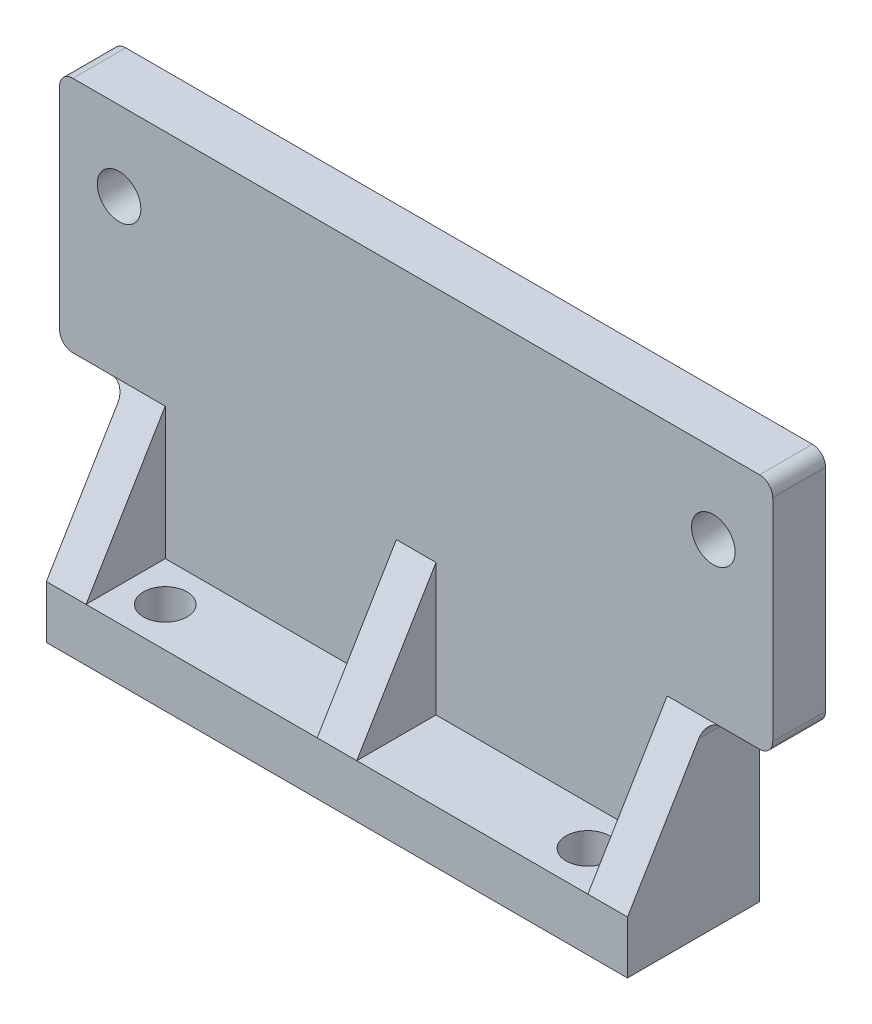
ISO-10303-21;
HEADER;
FILE_DESCRIPTION(('STEP AP214'),'2;1');
FILE_NAME('part.step','',(''),(''),'','','');
FILE_SCHEMA(('AUTOMOTIVE_DESIGN { 1 0 10303 214 1 1 1 1 }'));
ENDSEC;
DATA;
#1=APPLICATION_CONTEXT('core data for automotive mechanical design processes');
#2=APPLICATION_PROTOCOL_DEFINITION('international standard','automotive_design',2000,#1);
#3=PRODUCT_CONTEXT('',#1,'mechanical');
#4=PRODUCT('Part','Part','',(#3));
#5=PRODUCT_RELATED_PRODUCT_CATEGORY('part','',(#4));
#6=PRODUCT_DEFINITION_FORMATION('','',#4);
#7=PRODUCT_DEFINITION_CONTEXT('part definition',#1,'design');
#8=PRODUCT_DEFINITION('design','',#6,#7);
#9=PRODUCT_DEFINITION_SHAPE('','',#8);
#10=(LENGTH_UNIT() NAMED_UNIT(*) SI_UNIT(.MILLI.,.METRE.));
#11=(NAMED_UNIT(*) PLANE_ANGLE_UNIT() SI_UNIT($,.RADIAN.));
#12=(NAMED_UNIT(*) SI_UNIT($,.STERADIAN.) SOLID_ANGLE_UNIT());
#13=UNCERTAINTY_MEASURE_WITH_UNIT(LENGTH_MEASURE(1.E-05),#10,'distance_accuracy_value','');
#14=(GEOMETRIC_REPRESENTATION_CONTEXT(3) GLOBAL_UNCERTAINTY_ASSIGNED_CONTEXT((#13)) GLOBAL_UNIT_ASSIGNED_CONTEXT((#10,
#11,#12)) REPRESENTATION_CONTEXT('',''));
#15=CARTESIAN_POINT('',(0.,0.,0.));
#16=DIRECTION('',(0.,0.,1.));
#17=DIRECTION('',(1.,0.,0.));
#18=AXIS2_PLACEMENT_3D('',#15,#16,#17);
#19=CARTESIAN_POINT('',(0.,4.,0.));
#20=DIRECTION('',(1.,0.,0.));
#21=DIRECTION('',(0.,0.,-1.));
#22=AXIS2_PLACEMENT_3D('',#19,#20,#21);
#23=PLANE('',#22);
#24=DIRECTION('',(0.,-0.857492925712544,0.514495755427526));
#25=VECTOR('',#24,1.);
#26=CARTESIAN_POINT('',(0.,14.,-6.));
#27=LINE('',#26,#25);
#28=CARTESIAN_POINT('',(0.,13.,-5.4));
#29=VERTEX_POINT('',#28);
#30=CARTESIAN_POINT('',(0.,4.,0.));
#31=VERTEX_POINT('',#30);
#32=EDGE_CURVE('E302',#29,#31,#27,.T.);
#33=ORIENTED_EDGE('',*,*,#32,.F.);
#34=DIRECTION('',(0.,0.,1.));
#35=VECTOR('',#34,1.);
#36=CARTESIAN_POINT('',(0.,13.,-10.));
#37=LINE('',#36,#35);
#38=CARTESIAN_POINT('',(0.,13.,-10.));
#39=VERTEX_POINT('',#38);
#40=EDGE_CURVE('E286',#29,#39,#37,.F.);
#41=ORIENTED_EDGE('',*,*,#40,.T.);
#42=DIRECTION('',(0.,-1.,0.));
#43=VECTOR('',#42,1.);
#44=CARTESIAN_POINT('',(0.,4.,-10.));
#45=LINE('',#44,#43);
#46=CARTESIAN_POINT('',(0.,0.,-10.));
#47=VERTEX_POINT('',#46);
#48=EDGE_CURVE('E327',#39,#47,#45,.T.);
#49=ORIENTED_EDGE('',*,*,#48,.T.);
#50=DIRECTION('',(0.,0.,1.));
#51=VECTOR('',#50,1.);
#52=CARTESIAN_POINT('',(0.,0.,0.));
#53=LINE('',#52,#51);
#54=CARTESIAN_POINT('',(0.,0.,0.));
#55=VERTEX_POINT('',#54);
#56=EDGE_CURVE('E407',#47,#55,#53,.T.);
#57=ORIENTED_EDGE('',*,*,#56,.T.);
#58=DIRECTION('',(0.,-1.,0.));
#59=VECTOR('',#58,1.);
#60=CARTESIAN_POINT('',(0.,4.,0.));
#61=LINE('',#60,#59);
#62=EDGE_CURVE('E313',#31,#55,#61,.T.);
#63=ORIENTED_EDGE('',*,*,#62,.F.);
#64=EDGE_LOOP('',(#33,#41,#49,#57,#63));
#65=FACE_BOUND('',#64,.T.);
#66=ADVANCED_FACE('F39',(#65),#23,.F.);
#67=CARTESIAN_POINT('',(44.,4.,0.));
#68=DIRECTION('',(-1.,0.,0.));
#69=DIRECTION('',(0.,0.,1.));
#70=AXIS2_PLACEMENT_3D('',#67,#68,#69);
#71=PLANE('',#70);
#72=DIRECTION('',(0.,-1.,0.));
#73=VECTOR('',#72,1.);
#74=CARTESIAN_POINT('',(44.,4.,-10.));
#75=LINE('',#74,#73);
#76=CARTESIAN_POINT('',(44.,13.,-10.));
#77=VERTEX_POINT('',#76);
#78=CARTESIAN_POINT('',(44.,0.,-10.));
#79=VERTEX_POINT('',#78);
#80=EDGE_CURVE('E429',#77,#79,#75,.T.);
#81=ORIENTED_EDGE('',*,*,#80,.F.);
#82=DIRECTION('',(0.,0.,-1.));
#83=VECTOR('',#82,1.);
#84=CARTESIAN_POINT('',(44.,13.,-6.));
#85=LINE('',#84,#83);
#86=CARTESIAN_POINT('',(44.,13.,-5.4));
#87=VERTEX_POINT('',#86);
#88=EDGE_CURVE('E230',#77,#87,#85,.F.);
#89=ORIENTED_EDGE('',*,*,#88,.T.);
#90=DIRECTION('',(0.,-0.857492925712544,0.514495755427526));
#91=VECTOR('',#90,1.);
#92=CARTESIAN_POINT('',(44.,14.,-6.));
#93=LINE('',#92,#91);
#94=CARTESIAN_POINT('',(44.,4.,0.));
#95=VERTEX_POINT('',#94);
#96=EDGE_CURVE('E373',#87,#95,#93,.T.);
#97=ORIENTED_EDGE('',*,*,#96,.T.);
#98=DIRECTION('',(0.,-1.,0.));
#99=VECTOR('',#98,1.);
#100=CARTESIAN_POINT('',(44.,4.,0.));
#101=LINE('',#100,#99);
#102=CARTESIAN_POINT('',(44.,0.,0.));
#103=VERTEX_POINT('',#102);
#104=EDGE_CURVE('E432',#95,#103,#101,.T.);
#105=ORIENTED_EDGE('',*,*,#104,.T.);
#106=DIRECTION('',(0.,0.,-1.));
#107=VECTOR('',#106,1.);
#108=CARTESIAN_POINT('',(44.,0.,0.));
#109=LINE('',#108,#107);
#110=EDGE_CURVE('E420',#103,#79,#109,.T.);
#111=ORIENTED_EDGE('',*,*,#110,.T.);
#112=EDGE_LOOP('',(#81,#89,#97,#105,#111));
#113=FACE_BOUND('',#112,.T.);
#114=ADVANCED_FACE('F529',(#113),#71,.F.);
#115=CARTESIAN_POINT('',(0.,4.,0.));
#116=DIRECTION('',(0.,-1.,0.));
#117=DIRECTION('',(0.,0.,-1.));
#118=AXIS2_PLACEMENT_3D('',#115,#116,#117);
#119=PLANE('',#118);
#120=CARTESIAN_POINT('',(6.,4.,-3.));
#121=DIRECTION('',(0.,1.,0.));
#122=DIRECTION('',(0.,0.,1.));
#123=AXIS2_PLACEMENT_3D('',#120,#121,#122);
#124=CIRCLE('',#123,1.65);
#125=CARTESIAN_POINT('',(6.,4.,-1.35));
#126=VERTEX_POINT('',#125);
#127=EDGE_CURVE('E395',#126,#126,#124,.T.);
#128=ORIENTED_EDGE('',*,*,#127,.F.);
#129=EDGE_LOOP('',(#128));
#130=FACE_BOUND('',#129,.T.);
#131=DIRECTION('',(1.,0.,0.));
#132=VECTOR('',#131,1.);
#133=CARTESIAN_POINT('',(0.,4.,-6.));
#134=LINE('',#133,#132);
#135=CARTESIAN_POINT('',(3.,4.,-6.));
#136=VERTEX_POINT('',#135);
#137=CARTESIAN_POINT('',(20.5,4.,-6.));
#138=VERTEX_POINT('',#137);
#139=EDGE_CURVE('E176',#136,#138,#134,.T.);
#140=ORIENTED_EDGE('',*,*,#139,.F.);
#141=DIRECTION('',(0.,0.,1.));
#142=VECTOR('',#141,1.);
#143=CARTESIAN_POINT('',(3.,4.,0.));
#144=LINE('',#143,#142);
#145=CARTESIAN_POINT('',(3.,4.,0.));
#146=VERTEX_POINT('',#145);
#147=EDGE_CURVE('E357',#136,#146,#144,.T.);
#148=ORIENTED_EDGE('',*,*,#147,.T.);
#149=DIRECTION('',(1.,0.,0.));
#150=VECTOR('',#149,1.);
#151=CARTESIAN_POINT('',(0.,4.,0.));
#152=LINE('',#151,#150);
#153=CARTESIAN_POINT('',(20.5,4.,0.));
#154=VERTEX_POINT('',#153);
#155=EDGE_CURVE('E194',#146,#154,#152,.T.);
#156=ORIENTED_EDGE('',*,*,#155,.T.);
#157=DIRECTION('',(0.,0.,1.));
#158=VECTOR('',#157,1.);
#159=CARTESIAN_POINT('',(20.5,4.,0.));
#160=LINE('',#159,#158);
#161=EDGE_CURVE('E191',#138,#154,#160,.T.);
#162=ORIENTED_EDGE('',*,*,#161,.F.);
#163=EDGE_LOOP('',(#140,#148,#156,#162));
#164=FACE_BOUND('',#163,.T.);
#165=ADVANCED_FACE('F192',(#130,#164),#119,.F.);
#166=CARTESIAN_POINT('',(38.,4.,-3.));
#167=DIRECTION('',(0.,1.,0.));
#168=DIRECTION('',(0.,0.,1.));
#169=AXIS2_PLACEMENT_3D('',#166,#167,#168);
#170=CIRCLE('',#169,1.65);
#171=CARTESIAN_POINT('',(38.,4.,-1.35000000000001));
#172=VERTEX_POINT('',#171);
#173=EDGE_CURVE('E403',#172,#172,#170,.T.);
#174=ORIENTED_EDGE('',*,*,#173,.F.);
#175=EDGE_LOOP('',(#174));
#176=FACE_BOUND('',#175,.T.);
#177=CARTESIAN_POINT('',(23.5,4.,-6.));
#178=VERTEX_POINT('',#177);
#179=CARTESIAN_POINT('',(41.,4.,-6.));
#180=VERTEX_POINT('',#179);
#181=EDGE_CURVE('E188',#178,#180,#134,.T.);
#182=ORIENTED_EDGE('',*,*,#181,.F.);
#183=DIRECTION('',(0.,0.,1.));
#184=VECTOR('',#183,1.);
#185=CARTESIAN_POINT('',(23.5,4.,0.));
#186=LINE('',#185,#184);
#187=CARTESIAN_POINT('',(23.5,4.,0.));
#188=VERTEX_POINT('',#187);
#189=EDGE_CURVE('E200',#178,#188,#186,.T.);
#190=ORIENTED_EDGE('',*,*,#189,.T.);
#191=CARTESIAN_POINT('',(41.,4.,0.));
#192=VERTEX_POINT('',#191);
#193=EDGE_CURVE('E414',#188,#192,#152,.T.);
#194=ORIENTED_EDGE('',*,*,#193,.T.);
#195=DIRECTION('',(0.,0.,1.));
#196=VECTOR('',#195,1.);
#197=CARTESIAN_POINT('',(41.,4.,0.));
#198=LINE('',#197,#196);
#199=EDGE_CURVE('E376',#180,#192,#198,.T.);
#200=ORIENTED_EDGE('',*,*,#199,.F.);
#201=EDGE_LOOP('',(#182,#190,#194,#200));
#202=FACE_BOUND('',#201,.T.);
#203=ADVANCED_FACE('F558',(#176,#202),#119,.F.);
#204=CARTESIAN_POINT('',(0.,0.,0.));
#205=DIRECTION('',(0.,-1.,0.));
#206=DIRECTION('',(0.,0.,-1.));
#207=AXIS2_PLACEMENT_3D('',#204,#205,#206);
#208=PLANE('',#207);
#209=ORIENTED_EDGE('',*,*,#110,.F.);
#210=DIRECTION('',(1.,0.,0.));
#211=VECTOR('',#210,1.);
#212=CARTESIAN_POINT('',(0.,0.,0.));
#213=LINE('',#212,#211);
#214=EDGE_CURVE('E417',#55,#103,#213,.T.);
#215=ORIENTED_EDGE('',*,*,#214,.F.);
#216=ORIENTED_EDGE('',*,*,#56,.F.);
#217=DIRECTION('',(-1.,0.,0.));
#218=VECTOR('',#217,1.);
#219=CARTESIAN_POINT('',(0.,0.,-10.));
#220=LINE('',#219,#218);
#221=EDGE_CURVE('E424',#79,#47,#220,.T.);
#222=ORIENTED_EDGE('',*,*,#221,.F.);
#223=EDGE_LOOP('',(#209,#215,#216,#222));
#224=FACE_BOUND('',#223,.T.);
#225=CARTESIAN_POINT('',(38.,0.,-3.));
#226=DIRECTION('',(0.,1.,0.));
#227=DIRECTION('',(0.,0.,1.));
#228=AXIS2_PLACEMENT_3D('',#225,#226,#227);
#229=CIRCLE('',#228,1.65);
#230=CARTESIAN_POINT('',(38.,0.,-1.35000000000001));
#231=VERTEX_POINT('',#230);
#232=EDGE_CURVE('E399',#231,#231,#229,.T.);
#233=ORIENTED_EDGE('',*,*,#232,.T.);
#234=EDGE_LOOP('',(#233));
#235=FACE_BOUND('',#234,.T.);
#236=CARTESIAN_POINT('',(6.,0.,-3.));
#237=DIRECTION('',(0.,1.,0.));
#238=DIRECTION('',(0.,0.,1.));
#239=AXIS2_PLACEMENT_3D('',#236,#237,#238);
#240=CIRCLE('',#239,1.65);
#241=CARTESIAN_POINT('',(6.,0.,-1.35));
#242=VERTEX_POINT('',#241);
#243=EDGE_CURVE('E393',#242,#242,#240,.T.);
#244=ORIENTED_EDGE('',*,*,#243,.T.);
#245=EDGE_LOOP('',(#244));
#246=FACE_BOUND('',#245,.T.);
#247=ADVANCED_FACE('F564',(#224,#235,#246),#208,.T.);
#248=CARTESIAN_POINT('',(0.,4.,0.));
#249=DIRECTION('',(0.,0.,-1.));
#250=DIRECTION('',(-1.,0.,0.));
#251=AXIS2_PLACEMENT_3D('',#248,#249,#250);
#252=PLANE('',#251);
#253=ORIENTED_EDGE('',*,*,#155,.F.);
#254=EDGE_CURVE('E411',#31,#146,#152,.T.);
#255=ORIENTED_EDGE('',*,*,#254,.F.);
#256=ORIENTED_EDGE('',*,*,#62,.T.);
#257=ORIENTED_EDGE('',*,*,#214,.T.);
#258=ORIENTED_EDGE('',*,*,#104,.F.);
#259=DIRECTION('',(1.,0.,0.));
#260=VECTOR('',#259,1.);
#261=CARTESIAN_POINT('',(0.,4.,0.));
#262=LINE('',#261,#260);
#263=EDGE_CURVE('E383',#192,#95,#262,.T.);
#264=ORIENTED_EDGE('',*,*,#263,.F.);
#265=ORIENTED_EDGE('',*,*,#193,.F.);
#266=DIRECTION('',(1.,0.,0.));
#267=VECTOR('',#266,1.);
#268=CARTESIAN_POINT('',(0.,4.,0.));
#269=LINE('',#268,#267);
#270=EDGE_CURVE('E368',#154,#188,#269,.T.);
#271=ORIENTED_EDGE('',*,*,#270,.F.);
#272=EDGE_LOOP('',(#253,#255,#256,#257,#258,#264,#265,#271));
#273=FACE_BOUND('',#272,.T.);
#274=ADVANCED_FACE('F538',(#273),#252,.F.);
#275=CARTESIAN_POINT('',(0.,4.,-10.));
#276=DIRECTION('',(0.,0.,1.));
#277=DIRECTION('',(1.,0.,0.));
#278=AXIS2_PLACEMENT_3D('',#275,#276,#277);
#279=PLANE('',#278);
#280=CARTESIAN_POINT('',(-0.499999999999994,26.,-10.));
#281=DIRECTION('',(0.,0.,1.));
#282=DIRECTION('',(1.,0.,0.));
#283=AXIS2_PLACEMENT_3D('',#280,#281,#282);
#284=CIRCLE('',#283,1.65);
#285=CARTESIAN_POINT('',(1.15,26.,-10.));
#286=VERTEX_POINT('',#285);
#287=EDGE_CURVE('E487',#286,#286,#284,.T.);
#288=ORIENTED_EDGE('',*,*,#287,.T.);
#289=EDGE_LOOP('',(#288));
#290=FACE_BOUND('',#289,.T.);
#291=CARTESIAN_POINT('',(44.5,26.,-10.));
#292=DIRECTION('',(0.,0.,1.));
#293=DIRECTION('',(1.,0.,0.));
#294=AXIS2_PLACEMENT_3D('',#291,#292,#293);
#295=CIRCLE('',#294,1.65);
#296=CARTESIAN_POINT('',(46.15,26.,-10.));
#297=VERTEX_POINT('',#296);
#298=EDGE_CURVE('E499',#297,#297,#295,.T.);
#299=ORIENTED_EDGE('',*,*,#298,.T.);
#300=EDGE_LOOP('',(#299));
#301=FACE_BOUND('',#300,.T.);
#302=DIRECTION('',(0.,1.,0.));
#303=VECTOR('',#302,1.);
#304=CARTESIAN_POINT('',(49.,14.,-10.));
#305=LINE('',#304,#303);
#306=CARTESIAN_POINT('',(49.,15.,-10.));
#307=VERTEX_POINT('',#306);
#308=CARTESIAN_POINT('',(49.,31.,-10.));
#309=VERTEX_POINT('',#308);
#310=EDGE_CURVE('E340',#307,#309,#305,.T.);
#311=ORIENTED_EDGE('',*,*,#310,.F.);
#312=CARTESIAN_POINT('',(48.,15.,-10.));
#313=DIRECTION('',(0.,0.,1.));
#314=DIRECTION('',(1.,0.,0.));
#315=AXIS2_PLACEMENT_3D('',#312,#313,#314);
#316=CIRCLE('',#315,1.);
#317=CARTESIAN_POINT('',(48.,14.,-10.));
#318=VERTEX_POINT('',#317);
#319=EDGE_CURVE('E250',#307,#318,#316,.F.);
#320=ORIENTED_EDGE('',*,*,#319,.T.);
#321=DIRECTION('',(-1.,0.,0.));
#322=VECTOR('',#321,1.);
#323=CARTESIAN_POINT('',(49.,14.,-10.));
#324=LINE('',#323,#322);
#325=CARTESIAN_POINT('',(45.,14.,-10.));
#326=VERTEX_POINT('',#325);
#327=EDGE_CURVE('E349',#318,#326,#324,.T.);
#328=ORIENTED_EDGE('',*,*,#327,.T.);
#329=CARTESIAN_POINT('',(45.,13.,-10.));
#330=DIRECTION('',(0.,0.,1.));
#331=DIRECTION('',(1.,0.,0.));
#332=AXIS2_PLACEMENT_3D('',#329,#330,#331);
#333=CIRCLE('',#332,1.);
#334=EDGE_CURVE('E289',#326,#77,#333,.T.);
#335=ORIENTED_EDGE('',*,*,#334,.T.);
#336=ORIENTED_EDGE('',*,*,#80,.T.);
#337=ORIENTED_EDGE('',*,*,#221,.T.);
#338=ORIENTED_EDGE('',*,*,#48,.F.);
#339=CARTESIAN_POINT('',(-1.,13.,-10.));
#340=DIRECTION('',(0.,0.,1.));
#341=DIRECTION('',(1.,0.,0.));
#342=AXIS2_PLACEMENT_3D('',#339,#340,#341);
#343=CIRCLE('',#342,1.);
#344=CARTESIAN_POINT('',(-1.,14.,-10.));
#345=VERTEX_POINT('',#344);
#346=EDGE_CURVE('E11',#39,#345,#343,.T.);
#347=ORIENTED_EDGE('',*,*,#346,.T.);
#348=DIRECTION('',(1.,0.,0.));
#349=VECTOR('',#348,1.);
#350=CARTESIAN_POINT('',(-5.,14.,-10.));
#351=LINE('',#350,#349);
#352=CARTESIAN_POINT('',(-4.,14.,-10.));
#353=VERTEX_POINT('',#352);
#354=EDGE_CURVE('E324',#353,#345,#351,.T.);
#355=ORIENTED_EDGE('',*,*,#354,.F.);
#356=CARTESIAN_POINT('',(-4.,15.,-10.));
#357=DIRECTION('',(0.,0.,1.));
#358=DIRECTION('',(1.,0.,0.));
#359=AXIS2_PLACEMENT_3D('',#356,#357,#358);
#360=CIRCLE('',#359,1.);
#361=CARTESIAN_POINT('',(-5.,15.,-10.));
#362=VERTEX_POINT('',#361);
#363=EDGE_CURVE('E241',#353,#362,#360,.F.);
#364=ORIENTED_EDGE('',*,*,#363,.T.);
#365=DIRECTION('',(0.,-1.,0.));
#366=VECTOR('',#365,1.);
#367=CARTESIAN_POINT('',(-5.,14.,-10.));
#368=LINE('',#367,#366);
#369=CARTESIAN_POINT('',(-5.,31.,-10.));
#370=VERTEX_POINT('',#369);
#371=EDGE_CURVE('E342',#370,#362,#368,.T.);
#372=ORIENTED_EDGE('',*,*,#371,.F.);
#373=CARTESIAN_POINT('',(-4.,31.,-10.));
#374=DIRECTION('',(0.,0.,1.));
#375=DIRECTION('',(1.,0.,0.));
#376=AXIS2_PLACEMENT_3D('',#373,#374,#375);
#377=CIRCLE('',#376,1.);
#378=CARTESIAN_POINT('',(-4.,32.,-10.));
#379=VERTEX_POINT('',#378);
#380=EDGE_CURVE('E244',#370,#379,#377,.F.);
#381=ORIENTED_EDGE('',*,*,#380,.T.);
#382=DIRECTION('',(-1.,0.,0.));
#383=VECTOR('',#382,1.);
#384=CARTESIAN_POINT('',(0.,32.,-10.));
#385=LINE('',#384,#383);
#386=CARTESIAN_POINT('',(48.,32.,-10.));
#387=VERTEX_POINT('',#386);
#388=EDGE_CURVE('E390',#387,#379,#385,.T.);
#389=ORIENTED_EDGE('',*,*,#388,.F.);
#390=CARTESIAN_POINT('',(48.,31.,-10.));
#391=DIRECTION('',(0.,0.,1.));
#392=DIRECTION('',(1.,0.,0.));
#393=AXIS2_PLACEMENT_3D('',#390,#391,#392);
#394=CIRCLE('',#393,1.);
#395=EDGE_CURVE('E247',#387,#309,#394,.F.);
#396=ORIENTED_EDGE('',*,*,#395,.T.);
#397=EDGE_LOOP('',(#311,#320,#328,#335,#336,#337,#338,#347,#355,#364,#372,#381,#389,#396));
#398=FACE_BOUND('',#397,.T.);
#399=ADVANCED_FACE('F323',(#290,#301,#398),#279,.F.);
#400=CARTESIAN_POINT('',(38.,4.,-3.));
#401=DIRECTION('',(0.,-1.,0.));
#402=DIRECTION('',(0.,0.,-1.));
#403=AXIS2_PLACEMENT_3D('',#400,#401,#402);
#404=CYLINDRICAL_SURFACE('',#403,1.65);
#405=ORIENTED_EDGE('',*,*,#173,.T.);
#406=EDGE_LOOP('',(#405));
#407=FACE_BOUND('',#406,.T.);
#408=ORIENTED_EDGE('',*,*,#232,.F.);
#409=EDGE_LOOP('',(#408));
#410=FACE_BOUND('',#409,.T.);
#411=ADVANCED_FACE('F574',(#407,#410),#404,.F.);
#412=CARTESIAN_POINT('',(6.,4.,-3.));
#413=DIRECTION('',(0.,-1.,0.));
#414=DIRECTION('',(0.,0.,-1.));
#415=AXIS2_PLACEMENT_3D('',#412,#413,#414);
#416=CYLINDRICAL_SURFACE('',#415,1.65);
#417=ORIENTED_EDGE('',*,*,#127,.T.);
#418=EDGE_LOOP('',(#417));
#419=FACE_BOUND('',#418,.T.);
#420=ORIENTED_EDGE('',*,*,#243,.F.);
#421=EDGE_LOOP('',(#420));
#422=FACE_BOUND('',#421,.T.);
#423=ADVANCED_FACE('F511',(#419,#422),#416,.F.);
#424=CARTESIAN_POINT('',(0.,32.,-6.));
#425=DIRECTION('',(0.,0.,-1.));
#426=DIRECTION('',(-1.,0.,0.));
#427=AXIS2_PLACEMENT_3D('',#424,#425,#426);
#428=PLANE('',#427);
#429=CARTESIAN_POINT('',(-0.499999999999994,26.,-6.));
#430=DIRECTION('',(0.,0.,1.));
#431=DIRECTION('',(1.,0.,0.));
#432=AXIS2_PLACEMENT_3D('',#429,#430,#431);
#433=CIRCLE('',#432,1.65);
#434=CARTESIAN_POINT('',(1.15,26.,-6.));
#435=VERTEX_POINT('',#434);
#436=EDGE_CURVE('E492',#435,#435,#433,.T.);
#437=ORIENTED_EDGE('',*,*,#436,.F.);
#438=EDGE_LOOP('',(#437));
#439=FACE_BOUND('',#438,.T.);
#440=CARTESIAN_POINT('',(44.5,26.,-6.));
#441=DIRECTION('',(0.,0.,1.));
#442=DIRECTION('',(1.,0.,0.));
#443=AXIS2_PLACEMENT_3D('',#440,#441,#442);
#444=CIRCLE('',#443,1.65);
#445=CARTESIAN_POINT('',(46.15,26.,-6.));
#446=VERTEX_POINT('',#445);
#447=EDGE_CURVE('E495',#446,#446,#444,.T.);
#448=ORIENTED_EDGE('',*,*,#447,.F.);
#449=EDGE_LOOP('',(#448));
#450=FACE_BOUND('',#449,.T.);
#451=DIRECTION('',(-1.,0.,0.));
#452=VECTOR('',#451,1.);
#453=CARTESIAN_POINT('',(49.,14.,-6.));
#454=LINE('',#453,#452);
#455=CARTESIAN_POINT('',(48.,14.,-6.));
#456=VERTEX_POINT('',#455);
#457=CARTESIAN_POINT('',(45.,14.,-6.));
#458=VERTEX_POINT('',#457);
#459=EDGE_CURVE('E316',#456,#458,#454,.T.);
#460=ORIENTED_EDGE('',*,*,#459,.F.);
#461=CARTESIAN_POINT('',(48.,15.,-6.));
#462=DIRECTION('',(0.,0.,-1.));
#463=DIRECTION('',(-1.,0.,0.));
#464=AXIS2_PLACEMENT_3D('',#461,#462,#463);
#465=CIRCLE('',#464,1.);
#466=CARTESIAN_POINT('',(49.,15.,-6.));
#467=VERTEX_POINT('',#466);
#468=EDGE_CURVE('E262',#456,#467,#465,.F.);
#469=ORIENTED_EDGE('',*,*,#468,.T.);
#470=DIRECTION('',(0.,-1.,0.));
#471=VECTOR('',#470,1.);
#472=CARTESIAN_POINT('',(49.,14.,-6.));
#473=LINE('',#472,#471);
#474=CARTESIAN_POINT('',(49.,31.,-6.));
#475=VERTEX_POINT('',#474);
#476=EDGE_CURVE('E334',#475,#467,#473,.T.);
#477=ORIENTED_EDGE('',*,*,#476,.F.);
#478=CARTESIAN_POINT('',(48.,31.,-6.));
#479=DIRECTION('',(0.,0.,-1.));
#480=DIRECTION('',(-1.,0.,0.));
#481=AXIS2_PLACEMENT_3D('',#478,#479,#480);
#482=CIRCLE('',#481,1.);
#483=CARTESIAN_POINT('',(48.,32.,-6.));
#484=VERTEX_POINT('',#483);
#485=EDGE_CURVE('E259',#475,#484,#482,.F.);
#486=ORIENTED_EDGE('',*,*,#485,.T.);
#487=DIRECTION('',(1.,0.,0.));
#488=VECTOR('',#487,1.);
#489=CARTESIAN_POINT('',(0.,32.,-6.));
#490=LINE('',#489,#488);
#491=CARTESIAN_POINT('',(-4.,32.,-6.));
#492=VERTEX_POINT('',#491);
#493=EDGE_CURVE('E187',#492,#484,#490,.T.);
#494=ORIENTED_EDGE('',*,*,#493,.F.);
#495=CARTESIAN_POINT('',(-4.,31.,-6.));
#496=DIRECTION('',(0.,0.,-1.));
#497=DIRECTION('',(-1.,0.,0.));
#498=AXIS2_PLACEMENT_3D('',#495,#496,#497);
#499=CIRCLE('',#498,1.);
#500=CARTESIAN_POINT('',(-5.,31.,-6.));
#501=VERTEX_POINT('',#500);
#502=EDGE_CURVE('E256',#492,#501,#499,.F.);
#503=ORIENTED_EDGE('',*,*,#502,.T.);
#504=DIRECTION('',(0.,1.,0.));
#505=VECTOR('',#504,1.);
#506=CARTESIAN_POINT('',(-5.,14.,-6.));
#507=LINE('',#506,#505);
#508=CARTESIAN_POINT('',(-5.,15.,-6.));
#509=VERTEX_POINT('',#508);
#510=EDGE_CURVE('E481',#509,#501,#507,.T.);
#511=ORIENTED_EDGE('',*,*,#510,.F.);
#512=CARTESIAN_POINT('',(-4.,15.,-6.));
#513=DIRECTION('',(0.,0.,-1.));
#514=DIRECTION('',(-1.,0.,0.));
#515=AXIS2_PLACEMENT_3D('',#512,#513,#514);
#516=CIRCLE('',#515,1.);
#517=CARTESIAN_POINT('',(-4.,14.,-6.));
#518=VERTEX_POINT('',#517);
#519=EDGE_CURVE('E253',#509,#518,#516,.F.);
#520=ORIENTED_EDGE('',*,*,#519,.T.);
#521=DIRECTION('',(1.,0.,0.));
#522=VECTOR('',#521,1.);
#523=CARTESIAN_POINT('',(-5.,14.,-6.));
#524=LINE('',#523,#522);
#525=CARTESIAN_POINT('',(-1.,14.,-6.));
#526=VERTEX_POINT('',#525);
#527=EDGE_CURVE('E335',#518,#526,#524,.T.);
#528=ORIENTED_EDGE('',*,*,#527,.T.);
#529=DIRECTION('',(1.,0.,0.));
#530=VECTOR('',#529,1.);
#531=CARTESIAN_POINT('',(0.,14.,-6.));
#532=LINE('',#531,#530);
#533=CARTESIAN_POINT('',(3.,14.,-6.));
#534=VERTEX_POINT('',#533);
#535=EDGE_CURVE('E220',#526,#534,#532,.T.);
#536=ORIENTED_EDGE('',*,*,#535,.T.);
#537=DIRECTION('',(0.,-1.,0.));
#538=VECTOR('',#537,1.);
#539=CARTESIAN_POINT('',(3.,32.,-6.));
#540=LINE('',#539,#538);
#541=EDGE_CURVE('E183',#534,#136,#540,.T.);
#542=ORIENTED_EDGE('',*,*,#541,.T.);
#543=ORIENTED_EDGE('',*,*,#139,.T.);
#544=DIRECTION('',(0.,-1.,0.));
#545=VECTOR('',#544,1.);
#546=CARTESIAN_POINT('',(20.5,32.,-6.));
#547=LINE('',#546,#545);
#548=CARTESIAN_POINT('',(20.5,14.,-6.));
#549=VERTEX_POINT('',#548);
#550=EDGE_CURVE('E180',#549,#138,#547,.T.);
#551=ORIENTED_EDGE('',*,*,#550,.F.);
#552=DIRECTION('',(1.,0.,0.));
#553=VECTOR('',#552,1.);
#554=CARTESIAN_POINT('',(0.,14.,-6.));
#555=LINE('',#554,#553);
#556=CARTESIAN_POINT('',(23.5,14.,-6.));
#557=VERTEX_POINT('',#556);
#558=EDGE_CURVE('E206',#549,#557,#555,.T.);
#559=ORIENTED_EDGE('',*,*,#558,.T.);
#560=DIRECTION('',(0.,-1.,0.));
#561=VECTOR('',#560,1.);
#562=CARTESIAN_POINT('',(23.5,32.,-6.));
#563=LINE('',#562,#561);
#564=EDGE_CURVE('E210',#557,#178,#563,.T.);
#565=ORIENTED_EDGE('',*,*,#564,.T.);
#566=ORIENTED_EDGE('',*,*,#181,.T.);
#567=DIRECTION('',(0.,-1.,0.));
#568=VECTOR('',#567,1.);
#569=CARTESIAN_POINT('',(41.,32.,-6.));
#570=LINE('',#569,#568);
#571=CARTESIAN_POINT('',(41.,14.,-6.));
#572=VERTEX_POINT('',#571);
#573=EDGE_CURVE('E212',#572,#180,#570,.T.);
#574=ORIENTED_EDGE('',*,*,#573,.F.);
#575=DIRECTION('',(1.,0.,0.));
#576=VECTOR('',#575,1.);
#577=CARTESIAN_POINT('',(0.,14.,-6.));
#578=LINE('',#577,#576);
#579=EDGE_CURVE('E56',#572,#458,#578,.T.);
#580=ORIENTED_EDGE('',*,*,#579,.T.);
#581=EDGE_LOOP('',(#460,#469,#477,#486,#494,#503,#511,#520,#528,#536,#542,#543,#551,#559,#565,
#566,#574,#580));
#582=FACE_BOUND('',#581,.T.);
#583=ADVANCED_FACE('F178',(#439,#450,#582),#428,.F.);
#584=CARTESIAN_POINT('',(0.,32.,0.));
#585=DIRECTION('',(0.,1.,0.));
#586=DIRECTION('',(0.,0.,1.));
#587=AXIS2_PLACEMENT_3D('',#584,#585,#586);
#588=PLANE('',#587);
#589=ORIENTED_EDGE('',*,*,#493,.T.);
#590=DIRECTION('',(0.,0.,1.));
#591=VECTOR('',#590,1.);
#592=CARTESIAN_POINT('',(48.,32.,-10.));
#593=LINE('',#592,#591);
#594=EDGE_CURVE('E268',#484,#387,#593,.F.);
#595=ORIENTED_EDGE('',*,*,#594,.T.);
#596=ORIENTED_EDGE('',*,*,#388,.T.);
#597=DIRECTION('',(0.,0.,-1.));
#598=VECTOR('',#597,1.);
#599=CARTESIAN_POINT('',(-4.,32.,0.));
#600=LINE('',#599,#598);
#601=EDGE_CURVE('E265',#379,#492,#600,.F.);
#602=ORIENTED_EDGE('',*,*,#601,.T.);
#603=EDGE_LOOP('',(#589,#595,#596,#602));
#604=FACE_BOUND('',#603,.T.);
#605=ADVANCED_FACE('F470',(#604),#588,.T.);
#606=CARTESIAN_POINT('',(44.,14.,-6.));
#607=DIRECTION('',(0.,0.514495755427526,0.857492925712544));
#608=DIRECTION('',(0.,-0.857492925712544,0.514495755427526));
#609=AXIS2_PLACEMENT_3D('',#606,#607,#608);
#610=PLANE('',#609);
#611=DIRECTION('',(0.,-0.857492925712544,0.514495755427526));
#612=VECTOR('',#611,1.);
#613=CARTESIAN_POINT('',(41.,14.,-6.));
#614=LINE('',#613,#612);
#615=EDGE_CURVE('E372',#572,#192,#614,.T.);
#616=ORIENTED_EDGE('',*,*,#615,.T.);
#617=ORIENTED_EDGE('',*,*,#263,.T.);
#618=ORIENTED_EDGE('',*,*,#96,.F.);
#619=CARTESIAN_POINT('',(45.,13.,-5.4));
#620=DIRECTION('',(0.,0.514495755427526,0.857492925712544));
#621=DIRECTION('',(0.,-0.857492925712544,0.514495755427526));
#622=AXIS2_PLACEMENT_3D('',#619,#620,#621);
#623=ELLIPSE('',#622,1.16619037896906,1.);
#624=EDGE_CURVE('E292',#87,#458,#623,.F.);
#625=ORIENTED_EDGE('',*,*,#624,.T.);
#626=ORIENTED_EDGE('',*,*,#579,.F.);
#627=EDGE_LOOP('',(#616,#617,#618,#625,#626));
#628=FACE_BOUND('',#627,.T.);
#629=ADVANCED_FACE('F445',(#628),#610,.T.);
#630=CARTESIAN_POINT('',(41.,16.,-5.));
#631=DIRECTION('',(1.,0.,0.));
#632=DIRECTION('',(0.,0.,-1.));
#633=AXIS2_PLACEMENT_3D('',#630,#631,#632);
#634=PLANE('',#633);
#635=ORIENTED_EDGE('',*,*,#573,.T.);
#636=ORIENTED_EDGE('',*,*,#199,.T.);
#637=ORIENTED_EDGE('',*,*,#615,.F.);
#638=EDGE_LOOP('',(#635,#636,#637));
#639=FACE_BOUND('',#638,.T.);
#640=ADVANCED_FACE('F441',(#639),#634,.F.);
#641=CARTESIAN_POINT('',(23.5,14.,-6.));
#642=DIRECTION('',(0.,0.514495755427526,0.857492925712544));
#643=DIRECTION('',(0.,-0.857492925712544,0.514495755427526));
#644=AXIS2_PLACEMENT_3D('',#641,#642,#643);
#645=PLANE('',#644);
#646=DIRECTION('',(0.,-0.857492925712544,0.514495755427526));
#647=VECTOR('',#646,1.);
#648=CARTESIAN_POINT('',(20.5,14.,-6.));
#649=LINE('',#648,#647);
#650=EDGE_CURVE('E204',#549,#154,#649,.T.);
#651=ORIENTED_EDGE('',*,*,#650,.T.);
#652=ORIENTED_EDGE('',*,*,#270,.T.);
#653=DIRECTION('',(0.,-0.857492925712544,0.514495755427526));
#654=VECTOR('',#653,1.);
#655=CARTESIAN_POINT('',(23.5,14.,-6.));
#656=LINE('',#655,#654);
#657=EDGE_CURVE('E201',#557,#188,#656,.T.);
#658=ORIENTED_EDGE('',*,*,#657,.F.);
#659=ORIENTED_EDGE('',*,*,#558,.F.);
#660=EDGE_LOOP('',(#651,#652,#658,#659));
#661=FACE_BOUND('',#660,.T.);
#662=ADVANCED_FACE('F773',(#661),#645,.T.);
#663=CARTESIAN_POINT('',(23.5,16.,-5.));
#664=DIRECTION('',(1.,0.,0.));
#665=DIRECTION('',(0.,0.,-1.));
#666=AXIS2_PLACEMENT_3D('',#663,#664,#665);
#667=PLANE('',#666);
#668=ORIENTED_EDGE('',*,*,#189,.F.);
#669=ORIENTED_EDGE('',*,*,#564,.F.);
#670=ORIENTED_EDGE('',*,*,#657,.T.);
#671=EDGE_LOOP('',(#668,#669,#670));
#672=FACE_BOUND('',#671,.T.);
#673=ADVANCED_FACE('F781',(#672),#667,.T.);
#674=CARTESIAN_POINT('',(20.5,16.,-5.));
#675=DIRECTION('',(1.,0.,0.));
#676=DIRECTION('',(0.,0.,-1.));
#677=AXIS2_PLACEMENT_3D('',#674,#675,#676);
#678=PLANE('',#677);
#679=ORIENTED_EDGE('',*,*,#550,.T.);
#680=ORIENTED_EDGE('',*,*,#161,.T.);
#681=ORIENTED_EDGE('',*,*,#650,.F.);
#682=EDGE_LOOP('',(#679,#680,#681));
#683=FACE_BOUND('',#682,.T.);
#684=ADVANCED_FACE('F203',(#683),#678,.F.);
#685=CARTESIAN_POINT('',(3.,14.,-6.));
#686=DIRECTION('',(0.,0.514495755427526,0.857492925712544));
#687=DIRECTION('',(0.,-0.857492925712544,0.514495755427526));
#688=AXIS2_PLACEMENT_3D('',#685,#686,#687);
#689=PLANE('',#688);
#690=ORIENTED_EDGE('',*,*,#535,.F.);
#691=CARTESIAN_POINT('',(-1.,13.,-5.4));
#692=DIRECTION('',(0.,0.514495755427526,0.857492925712544));
#693=DIRECTION('',(0.,0.857492925712544,-0.514495755427526));
#694=AXIS2_PLACEMENT_3D('',#691,#692,#693);
#695=ELLIPSE('',#694,1.16619037896906,1.);
#696=EDGE_CURVE('E49',#526,#29,#695,.F.);
#697=ORIENTED_EDGE('',*,*,#696,.T.);
#698=ORIENTED_EDGE('',*,*,#32,.T.);
#699=ORIENTED_EDGE('',*,*,#254,.T.);
#700=DIRECTION('',(0.,-0.857492925712544,0.514495755427526));
#701=VECTOR('',#700,1.);
#702=CARTESIAN_POINT('',(3.,14.,-6.));
#703=LINE('',#702,#701);
#704=EDGE_CURVE('E315',#534,#146,#703,.T.);
#705=ORIENTED_EDGE('',*,*,#704,.F.);
#706=EDGE_LOOP('',(#690,#697,#698,#699,#705));
#707=FACE_BOUND('',#706,.T.);
#708=ADVANCED_FACE('F300',(#707),#689,.T.);
#709=CARTESIAN_POINT('',(3.,16.,-5.));
#710=DIRECTION('',(1.,0.,0.));
#711=DIRECTION('',(0.,0.,-1.));
#712=AXIS2_PLACEMENT_3D('',#709,#710,#711);
#713=PLANE('',#712);
#714=ORIENTED_EDGE('',*,*,#541,.F.);
#715=ORIENTED_EDGE('',*,*,#704,.T.);
#716=ORIENTED_EDGE('',*,*,#147,.F.);
#717=EDGE_LOOP('',(#714,#715,#716));
#718=FACE_BOUND('',#717,.T.);
#719=ADVANCED_FACE('F551',(#718),#713,.T.);
#720=CARTESIAN_POINT('',(49.,14.,-6.));
#721=DIRECTION('',(0.,1.,0.));
#722=DIRECTION('',(0.,0.,1.));
#723=AXIS2_PLACEMENT_3D('',#720,#721,#722);
#724=PLANE('',#723);
#725=ORIENTED_EDGE('',*,*,#459,.T.);
#726=DIRECTION('',(0.,0.,-1.));
#727=VECTOR('',#726,1.);
#728=CARTESIAN_POINT('',(45.,14.,-10.));
#729=LINE('',#728,#727);
#730=EDGE_CURVE('E226',#458,#326,#729,.T.);
#731=ORIENTED_EDGE('',*,*,#730,.T.);
#732=ORIENTED_EDGE('',*,*,#327,.F.);
#733=DIRECTION('',(0.,0.,-1.));
#734=VECTOR('',#733,1.);
#735=CARTESIAN_POINT('',(48.,14.,-6.));
#736=LINE('',#735,#734);
#737=EDGE_CURVE('E223',#318,#456,#736,.F.);
#738=ORIENTED_EDGE('',*,*,#737,.T.);
#739=EDGE_LOOP('',(#725,#731,#732,#738));
#740=FACE_BOUND('',#739,.T.);
#741=ADVANCED_FACE('F454',(#740),#724,.F.);
#742=CARTESIAN_POINT('',(49.,0.,0.));
#743=DIRECTION('',(-1.,0.,0.));
#744=DIRECTION('',(0.,0.,1.));
#745=AXIS2_PLACEMENT_3D('',#742,#743,#744);
#746=PLANE('',#745);
#747=ORIENTED_EDGE('',*,*,#476,.T.);
#748=DIRECTION('',(0.,0.,-1.));
#749=VECTOR('',#748,1.);
#750=CARTESIAN_POINT('',(49.,15.,0.));
#751=LINE('',#750,#749);
#752=EDGE_CURVE('E237',#467,#307,#751,.T.);
#753=ORIENTED_EDGE('',*,*,#752,.T.);
#754=ORIENTED_EDGE('',*,*,#310,.T.);
#755=DIRECTION('',(0.,0.,1.));
#756=VECTOR('',#755,1.);
#757=CARTESIAN_POINT('',(49.,31.,-6.));
#758=LINE('',#757,#756);
#759=EDGE_CURVE('E233',#309,#475,#758,.T.);
#760=ORIENTED_EDGE('',*,*,#759,.T.);
#761=EDGE_LOOP('',(#747,#753,#754,#760));
#762=FACE_BOUND('',#761,.T.);
#763=ADVANCED_FACE('F462',(#762),#746,.F.);
#764=CARTESIAN_POINT('',(-5.,14.,-6.));
#765=DIRECTION('',(0.,1.,0.));
#766=DIRECTION('',(0.,0.,1.));
#767=AXIS2_PLACEMENT_3D('',#764,#765,#766);
#768=PLANE('',#767);
#769=ORIENTED_EDGE('',*,*,#527,.F.);
#770=DIRECTION('',(0.,0.,1.));
#771=VECTOR('',#770,1.);
#772=CARTESIAN_POINT('',(-4.,14.,-10.));
#773=LINE('',#772,#771);
#774=EDGE_CURVE('E283',#518,#353,#773,.F.);
#775=ORIENTED_EDGE('',*,*,#774,.T.);
#776=ORIENTED_EDGE('',*,*,#354,.T.);
#777=DIRECTION('',(0.,0.,1.));
#778=VECTOR('',#777,1.);
#779=CARTESIAN_POINT('',(-1.,14.,-6.));
#780=LINE('',#779,#778);
#781=EDGE_CURVE('E279',#345,#526,#780,.T.);
#782=ORIENTED_EDGE('',*,*,#781,.T.);
#783=EDGE_LOOP('',(#769,#775,#776,#782));
#784=FACE_BOUND('',#783,.T.);
#785=ADVANCED_FACE('F330',(#784),#768,.F.);
#786=CARTESIAN_POINT('',(-5.,0.,0.));
#787=DIRECTION('',(-1.,0.,0.));
#788=DIRECTION('',(0.,0.,1.));
#789=AXIS2_PLACEMENT_3D('',#786,#787,#788);
#790=PLANE('',#789);
#791=ORIENTED_EDGE('',*,*,#510,.T.);
#792=DIRECTION('',(0.,0.,-1.));
#793=VECTOR('',#792,1.);
#794=CARTESIAN_POINT('',(-5.,31.,0.));
#795=LINE('',#794,#793);
#796=EDGE_CURVE('E275',#501,#370,#795,.T.);
#797=ORIENTED_EDGE('',*,*,#796,.T.);
#798=ORIENTED_EDGE('',*,*,#371,.T.);
#799=DIRECTION('',(0.,0.,1.));
#800=VECTOR('',#799,1.);
#801=CARTESIAN_POINT('',(-5.,15.,-6.));
#802=LINE('',#801,#800);
#803=EDGE_CURVE('E271',#362,#509,#802,.T.);
#804=ORIENTED_EDGE('',*,*,#803,.T.);
#805=EDGE_LOOP('',(#791,#797,#798,#804));
#806=FACE_BOUND('',#805,.T.);
#807=ADVANCED_FACE('F483',(#806),#790,.T.);
#808=CARTESIAN_POINT('',(45.,13.,-6.));
#809=DIRECTION('',(0.,0.,1.));
#810=DIRECTION('',(1.,0.,0.));
#811=AXIS2_PLACEMENT_3D('',#808,#809,#810);
#812=CYLINDRICAL_SURFACE('',#811,1.);
#813=ORIENTED_EDGE('',*,*,#624,.F.);
#814=ORIENTED_EDGE('',*,*,#88,.F.);
#815=ORIENTED_EDGE('',*,*,#334,.F.);
#816=ORIENTED_EDGE('',*,*,#730,.F.);
#817=EDGE_LOOP('',(#813,#814,#815,#816));
#818=FACE_BOUND('',#817,.T.);
#819=ADVANCED_FACE('F451',(#818),#812,.F.);
#820=CARTESIAN_POINT('',(48.,15.,0.));
#821=DIRECTION('',(0.,0.,-1.));
#822=DIRECTION('',(-1.,0.,0.));
#823=AXIS2_PLACEMENT_3D('',#820,#821,#822);
#824=CYLINDRICAL_SURFACE('',#823,1.);
#825=ORIENTED_EDGE('',*,*,#468,.F.);
#826=ORIENTED_EDGE('',*,*,#737,.F.);
#827=ORIENTED_EDGE('',*,*,#319,.F.);
#828=ORIENTED_EDGE('',*,*,#752,.F.);
#829=EDGE_LOOP('',(#825,#826,#827,#828));
#830=FACE_BOUND('',#829,.T.);
#831=ADVANCED_FACE('F460',(#830),#824,.T.);
#832=CARTESIAN_POINT('',(48.,31.,0.));
#833=DIRECTION('',(0.,0.,-1.));
#834=DIRECTION('',(-1.,0.,0.));
#835=AXIS2_PLACEMENT_3D('',#832,#833,#834);
#836=CYLINDRICAL_SURFACE('',#835,1.);
#837=ORIENTED_EDGE('',*,*,#395,.F.);
#838=ORIENTED_EDGE('',*,*,#594,.F.);
#839=ORIENTED_EDGE('',*,*,#485,.F.);
#840=ORIENTED_EDGE('',*,*,#759,.F.);
#841=EDGE_LOOP('',(#837,#838,#839,#840));
#842=FACE_BOUND('',#841,.T.);
#843=ADVANCED_FACE('F474',(#842),#836,.T.);
#844=CARTESIAN_POINT('',(-4.,31.,0.));
#845=DIRECTION('',(0.,0.,-1.));
#846=DIRECTION('',(-1.,0.,0.));
#847=AXIS2_PLACEMENT_3D('',#844,#845,#846);
#848=CYLINDRICAL_SURFACE('',#847,1.);
#849=ORIENTED_EDGE('',*,*,#502,.F.);
#850=ORIENTED_EDGE('',*,*,#601,.F.);
#851=ORIENTED_EDGE('',*,*,#380,.F.);
#852=ORIENTED_EDGE('',*,*,#796,.F.);
#853=EDGE_LOOP('',(#849,#850,#851,#852));
#854=FACE_BOUND('',#853,.T.);
#855=ADVANCED_FACE('F477',(#854),#848,.T.);
#856=CARTESIAN_POINT('',(-4.,15.,0.));
#857=DIRECTION('',(0.,0.,-1.));
#858=DIRECTION('',(-1.,0.,0.));
#859=AXIS2_PLACEMENT_3D('',#856,#857,#858);
#860=CYLINDRICAL_SURFACE('',#859,1.);
#861=ORIENTED_EDGE('',*,*,#363,.F.);
#862=ORIENTED_EDGE('',*,*,#774,.F.);
#863=ORIENTED_EDGE('',*,*,#519,.F.);
#864=ORIENTED_EDGE('',*,*,#803,.F.);
#865=EDGE_LOOP('',(#861,#862,#863,#864));
#866=FACE_BOUND('',#865,.T.);
#867=ADVANCED_FACE('F525',(#866),#860,.T.);
#868=CARTESIAN_POINT('',(-1.,13.,-6.));
#869=DIRECTION('',(0.,0.,-1.));
#870=DIRECTION('',(-1.,0.,0.));
#871=AXIS2_PLACEMENT_3D('',#868,#869,#870);
#872=CYLINDRICAL_SURFACE('',#871,1.);
#873=ORIENTED_EDGE('',*,*,#346,.F.);
#874=ORIENTED_EDGE('',*,*,#40,.F.);
#875=ORIENTED_EDGE('',*,*,#696,.F.);
#876=ORIENTED_EDGE('',*,*,#781,.F.);
#877=EDGE_LOOP('',(#873,#874,#875,#876));
#878=FACE_BOUND('',#877,.T.);
#879=ADVANCED_FACE('F41',(#878),#872,.F.);
#880=CARTESIAN_POINT('',(44.5,26.,-10.));
#881=DIRECTION('',(0.,0.,1.));
#882=DIRECTION('',(1.,0.,0.));
#883=AXIS2_PLACEMENT_3D('',#880,#881,#882);
#884=CYLINDRICAL_SURFACE('',#883,1.65);
#885=ORIENTED_EDGE('',*,*,#298,.F.);
#886=EDGE_LOOP('',(#885));
#887=FACE_BOUND('',#886,.T.);
#888=ORIENTED_EDGE('',*,*,#447,.T.);
#889=EDGE_LOOP('',(#888));
#890=FACE_BOUND('',#889,.T.);
#891=ADVANCED_FACE('F515',(#887,#890),#884,.F.);
#892=CARTESIAN_POINT('',(-0.499999999999994,26.,-10.));
#893=DIRECTION('',(0.,0.,1.));
#894=DIRECTION('',(1.,0.,0.));
#895=AXIS2_PLACEMENT_3D('',#892,#893,#894);
#896=CYLINDRICAL_SURFACE('',#895,1.65);
#897=ORIENTED_EDGE('',*,*,#287,.F.);
#898=EDGE_LOOP('',(#897));
#899=FACE_BOUND('',#898,.T.);
#900=ORIENTED_EDGE('',*,*,#436,.T.);
#901=EDGE_LOOP('',(#900));
#902=FACE_BOUND('',#901,.T.);
#903=ADVANCED_FACE('F507',(#899,#902),#896,.F.);
#904=CLOSED_SHELL('',(#66,#114,#165,#203,#247,#274,#399,#411,#423,#583,#605,#629,#640,#662,#673,
#684,#708,#719,#741,#763,#785,#807,#819,#831,#843,#855,#867,#879,#891,#903));
#905=MANIFOLD_SOLID_BREP('B2',#904);
#906=ADVANCED_BREP_SHAPE_REPRESENTATION('',(#18,#905),#14);
#907=SHAPE_DEFINITION_REPRESENTATION(#9,#906);
ENDSEC;
END-ISO-10303-21;
